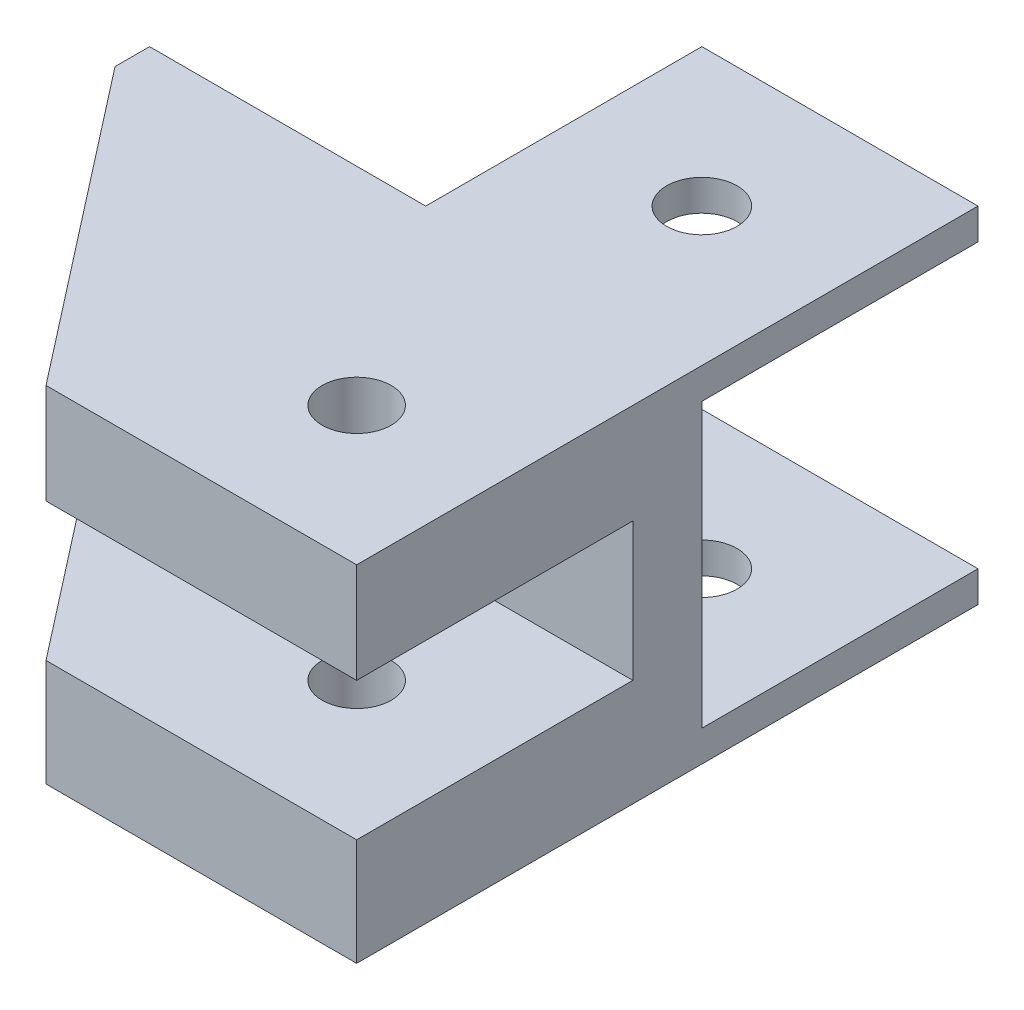
ISO-10303-21;
HEADER;
FILE_DESCRIPTION(('STEP AP214'),'2;1');
FILE_NAME('part.step','',(''),(''),'','','');
FILE_SCHEMA(('AUTOMOTIVE_DESIGN { 1 0 10303 214 1 1 1 1 }'));
ENDSEC;
DATA;
#1=APPLICATION_CONTEXT('core data for automotive mechanical design processes');
#2=APPLICATION_PROTOCOL_DEFINITION('international standard','automotive_design',2000,#1);
#3=PRODUCT_CONTEXT('',#1,'mechanical');
#4=PRODUCT('Part','Part','',(#3));
#5=PRODUCT_RELATED_PRODUCT_CATEGORY('part','',(#4));
#6=PRODUCT_DEFINITION_FORMATION('','',#4);
#7=PRODUCT_DEFINITION_CONTEXT('part definition',#1,'design');
#8=PRODUCT_DEFINITION('design','',#6,#7);
#9=PRODUCT_DEFINITION_SHAPE('','',#8);
#10=(LENGTH_UNIT() NAMED_UNIT(*) SI_UNIT(.MILLI.,.METRE.));
#11=(NAMED_UNIT(*) PLANE_ANGLE_UNIT() SI_UNIT($,.RADIAN.));
#12=(NAMED_UNIT(*) SI_UNIT($,.STERADIAN.) SOLID_ANGLE_UNIT());
#13=UNCERTAINTY_MEASURE_WITH_UNIT(LENGTH_MEASURE(1.E-05),#10,'distance_accuracy_value','');
#14=(GEOMETRIC_REPRESENTATION_CONTEXT(3) GLOBAL_UNCERTAINTY_ASSIGNED_CONTEXT((#13)) GLOBAL_UNIT_ASSIGNED_CONTEXT((#10,
#11,#12)) REPRESENTATION_CONTEXT('',''));
#15=CARTESIAN_POINT('',(0.,0.,0.));
#16=DIRECTION('',(0.,0.,1.));
#17=DIRECTION('',(1.,0.,0.));
#18=AXIS2_PLACEMENT_3D('',#15,#16,#17);
#19=CARTESIAN_POINT('',(20.,0.,-20.));
#20=DIRECTION('',(0.,0.,-1.));
#21=DIRECTION('',(0.,1.,0.));
#22=AXIS2_PLACEMENT_3D('',#19,#20,#21);
#23=PLANE('',#22);
#24=CARTESIAN_POINT('',(-10.,12.5,-20.));
#25=DIRECTION('',(0.,0.,1.));
#26=DIRECTION('',(1.,0.,0.));
#27=AXIS2_PLACEMENT_3D('',#24,#25,#26);
#28=CIRCLE('',#27,2.55);
#29=CARTESIAN_POINT('',(-7.45,12.5,-20.));
#30=VERTEX_POINT('',#29);
#31=EDGE_CURVE('E352',#30,#30,#28,.T.);
#32=ORIENTED_EDGE('',*,*,#31,.F.);
#33=EDGE_LOOP('',(#32));
#34=FACE_BOUND('',#33,.T.);
#35=DIRECTION('',(0.,1.,0.));
#36=VECTOR('',#35,1.);
#37=CARTESIAN_POINT('',(-18.0555555555555,0.,-20.));
#38=LINE('',#37,#36);
#39=CARTESIAN_POINT('',(-18.0555555555555,7.74999999999999,-20.));
#40=VERTEX_POINT('',#39);
#41=CARTESIAN_POINT('',(-18.0555555555555,17.75,-20.));
#42=VERTEX_POINT('',#41);
#43=EDGE_CURVE('E273',#40,#42,#38,.T.);
#44=ORIENTED_EDGE('',*,*,#43,.F.);
#45=DIRECTION('',(-1.,0.,0.));
#46=VECTOR('',#45,1.);
#47=CARTESIAN_POINT('',(20.,7.74999999999999,-20.));
#48=LINE('',#47,#46);
#49=CARTESIAN_POINT('',(20.,7.74999999999999,-20.));
#50=VERTEX_POINT('',#49);
#51=EDGE_CURVE('E43',#50,#40,#48,.T.);
#52=ORIENTED_EDGE('',*,*,#51,.F.);
#53=DIRECTION('',(0.,-1.,0.));
#54=VECTOR('',#53,1.);
#55=CARTESIAN_POINT('',(20.,0.,-20.));
#56=LINE('',#55,#54);
#57=CARTESIAN_POINT('',(20.,17.75,-20.));
#58=VERTEX_POINT('',#57);
#59=EDGE_CURVE('E227',#58,#50,#56,.T.);
#60=ORIENTED_EDGE('',*,*,#59,.F.);
#61=DIRECTION('',(-1.,0.,0.));
#62=VECTOR('',#61,1.);
#63=CARTESIAN_POINT('',(20.,17.75,-20.));
#64=LINE('',#63,#62);
#65=EDGE_CURVE('E172',#58,#42,#64,.T.);
#66=ORIENTED_EDGE('',*,*,#65,.T.);
#67=EDGE_LOOP('',(#44,#52,#60,#66));
#68=FACE_BOUND('',#67,.T.);
#69=ADVANCED_FACE('F35',(#34,#68),#23,.F.);
#70=CARTESIAN_POINT('',(20.,7.74999999999999,0.));
#71=DIRECTION('',(0.,-1.,0.));
#72=DIRECTION('',(0.,0.,-1.));
#73=AXIS2_PLACEMENT_3D('',#70,#71,#72);
#74=PLANE('',#73);
#75=CARTESIAN_POINT('',(10.,7.74999999999999,-10.));
#76=DIRECTION('',(0.,-1.,0.));
#77=DIRECTION('',(0.,0.,-1.));
#78=AXIS2_PLACEMENT_3D('',#75,#76,#77);
#79=CIRCLE('',#78,2.5);
#80=CARTESIAN_POINT('',(10.,7.74999999999999,-12.5));
#81=VERTEX_POINT('',#80);
#82=EDGE_CURVE('E197',#81,#81,#79,.T.);
#83=ORIENTED_EDGE('',*,*,#82,.T.);
#84=EDGE_LOOP('',(#83));
#85=FACE_BOUND('',#84,.T.);
#86=DIRECTION('',(-0.61394061351492,0.,-0.789352217376327));
#87=VECTOR('',#86,1.);
#88=CARTESIAN_POINT('',(5.98076923076923,7.74999999999999,10.9038461538461));
#89=LINE('',#88,#87);
#90=CARTESIAN_POINT('',(-2.50000000000001,7.74999999999999,0.));
#91=VERTEX_POINT('',#90);
#92=EDGE_CURVE('E278',#91,#40,#89,.T.);
#93=ORIENTED_EDGE('',*,*,#92,.F.);
#94=DIRECTION('',(-1.,0.,0.));
#95=VECTOR('',#94,1.);
#96=CARTESIAN_POINT('',(20.,7.74999999999999,0.));
#97=LINE('',#96,#95);
#98=CARTESIAN_POINT('',(20.,7.74999999999999,0.));
#99=VERTEX_POINT('',#98);
#100=EDGE_CURVE('E191',#99,#91,#97,.T.);
#101=ORIENTED_EDGE('',*,*,#100,.F.);
#102=DIRECTION('',(0.,0.,1.));
#103=VECTOR('',#102,1.);
#104=CARTESIAN_POINT('',(20.,7.74999999999999,0.));
#105=LINE('',#104,#103);
#106=EDGE_CURVE('E230',#50,#99,#105,.T.);
#107=ORIENTED_EDGE('',*,*,#106,.F.);
#108=ORIENTED_EDGE('',*,*,#51,.T.);
#109=EDGE_LOOP('',(#93,#101,#107,#108));
#110=FACE_BOUND('',#109,.T.);
#111=ADVANCED_FACE('F318',(#85,#110),#74,.F.);
#112=CARTESIAN_POINT('',(20.,0.,0.));
#113=DIRECTION('',(0.,0.,1.));
#114=DIRECTION('',(1.,0.,0.));
#115=AXIS2_PLACEMENT_3D('',#112,#113,#114);
#116=PLANE('',#115);
#117=ORIENTED_EDGE('',*,*,#100,.T.);
#118=DIRECTION('',(0.,-1.,0.));
#119=VECTOR('',#118,1.);
#120=CARTESIAN_POINT('',(-2.50000000000001,25.,0.));
#121=LINE('',#120,#119);
#122=CARTESIAN_POINT('',(-2.50000000000001,0.,0.));
#123=VERTEX_POINT('',#122);
#124=EDGE_CURVE('E150',#91,#123,#121,.T.);
#125=ORIENTED_EDGE('',*,*,#124,.T.);
#126=DIRECTION('',(-1.,0.,0.));
#127=VECTOR('',#126,1.);
#128=CARTESIAN_POINT('',(20.,0.,0.));
#129=LINE('',#128,#127);
#130=CARTESIAN_POINT('',(20.,0.,0.));
#131=VERTEX_POINT('',#130);
#132=EDGE_CURVE('E188',#131,#123,#129,.T.);
#133=ORIENTED_EDGE('',*,*,#132,.F.);
#134=DIRECTION('',(0.,1.,0.));
#135=VECTOR('',#134,1.);
#136=CARTESIAN_POINT('',(20.,0.,0.));
#137=LINE('',#136,#135);
#138=EDGE_CURVE('E233',#131,#99,#137,.T.);
#139=ORIENTED_EDGE('',*,*,#138,.T.);
#140=EDGE_LOOP('',(#117,#125,#133,#139));
#141=FACE_BOUND('',#140,.T.);
#142=ADVANCED_FACE('F314',(#141),#116,.T.);
#143=CARTESIAN_POINT('',(20.,0.,0.));
#144=DIRECTION('',(0.,1.,0.));
#145=DIRECTION('',(0.,0.,1.));
#146=AXIS2_PLACEMENT_3D('',#143,#144,#145);
#147=PLANE('',#146);
#148=CARTESIAN_POINT('',(10.,0.,-35.));
#149=DIRECTION('',(0.,1.,0.));
#150=DIRECTION('',(0.,0.,1.));
#151=AXIS2_PLACEMENT_3D('',#148,#149,#150);
#152=CIRCLE('',#151,2.55);
#153=CARTESIAN_POINT('',(10.,0.,-32.45));
#154=VERTEX_POINT('',#153);
#155=EDGE_CURVE('E210',#154,#154,#152,.T.);
#156=ORIENTED_EDGE('',*,*,#155,.T.);
#157=EDGE_LOOP('',(#156));
#158=FACE_BOUND('',#157,.T.);
#159=CARTESIAN_POINT('',(10.,0.,-10.));
#160=DIRECTION('',(0.,1.,0.));
#161=DIRECTION('',(0.,0.,1.));
#162=AXIS2_PLACEMENT_3D('',#159,#160,#161);
#163=CIRCLE('',#162,2.5);
#164=CARTESIAN_POINT('',(10.,0.,-7.5));
#165=VERTEX_POINT('',#164);
#166=EDGE_CURVE('E198',#165,#165,#163,.T.);
#167=ORIENTED_EDGE('',*,*,#166,.T.);
#168=EDGE_LOOP('',(#167));
#169=FACE_BOUND('',#168,.T.);
#170=DIRECTION('',(-0.61394061351492,0.,-0.789352217376327));
#171=VECTOR('',#170,1.);
#172=CARTESIAN_POINT('',(-1.55769230769231,0.,1.21153846153846));
#173=LINE('',#172,#171);
#174=CARTESIAN_POINT('',(-20.,0.,-22.5));
#175=VERTEX_POINT('',#174);
#176=EDGE_CURVE('E160',#123,#175,#173,.T.);
#177=ORIENTED_EDGE('',*,*,#176,.T.);
#178=DIRECTION('',(0.,0.,1.));
#179=VECTOR('',#178,1.);
#180=CARTESIAN_POINT('',(-20.,0.,0.));
#181=LINE('',#180,#179);
#182=CARTESIAN_POINT('',(-20.,0.,-25.));
#183=VERTEX_POINT('',#182);
#184=EDGE_CURVE('E286',#183,#175,#181,.T.);
#185=ORIENTED_EDGE('',*,*,#184,.F.);
#186=DIRECTION('',(1.,0.,0.));
#187=VECTOR('',#186,1.);
#188=CARTESIAN_POINT('',(-20.,0.,-25.));
#189=LINE('',#188,#187);
#190=CARTESIAN_POINT('',(0.,0.,-25.));
#191=VERTEX_POINT('',#190);
#192=EDGE_CURVE('E213',#183,#191,#189,.T.);
#193=ORIENTED_EDGE('',*,*,#192,.T.);
#194=DIRECTION('',(0.,0.,-1.));
#195=VECTOR('',#194,1.);
#196=CARTESIAN_POINT('',(0.,0.,0.));
#197=LINE('',#196,#195);
#198=CARTESIAN_POINT('',(0.,0.,-45.));
#199=VERTEX_POINT('',#198);
#200=EDGE_CURVE('E226',#191,#199,#197,.T.);
#201=ORIENTED_EDGE('',*,*,#200,.T.);
#202=DIRECTION('',(-1.,0.,0.));
#203=VECTOR('',#202,1.);
#204=CARTESIAN_POINT('',(20.,0.,-45.));
#205=LINE('',#204,#203);
#206=CARTESIAN_POINT('',(20.,0.,-45.));
#207=VERTEX_POINT('',#206);
#208=EDGE_CURVE('E185',#207,#199,#205,.T.);
#209=ORIENTED_EDGE('',*,*,#208,.F.);
#210=DIRECTION('',(0.,0.,-1.));
#211=VECTOR('',#210,1.);
#212=CARTESIAN_POINT('',(20.,0.,0.));
#213=LINE('',#212,#211);
#214=EDGE_CURVE('E236',#131,#207,#213,.T.);
#215=ORIENTED_EDGE('',*,*,#214,.F.);
#216=ORIENTED_EDGE('',*,*,#132,.T.);
#217=EDGE_LOOP('',(#177,#185,#193,#201,#209,#215,#216));
#218=FACE_BOUND('',#217,.T.);
#219=ADVANCED_FACE('F297',(#158,#169,#218),#147,.F.);
#220=CARTESIAN_POINT('',(20.,25.,0.));
#221=DIRECTION('',(0.,1.,0.));
#222=DIRECTION('',(0.,0.,1.));
#223=AXIS2_PLACEMENT_3D('',#220,#221,#222);
#224=PLANE('',#223);
#225=CARTESIAN_POINT('',(10.,25.,-10.));
#226=DIRECTION('',(0.,1.,0.));
#227=DIRECTION('',(0.,0.,1.));
#228=AXIS2_PLACEMENT_3D('',#225,#226,#227);
#229=CIRCLE('',#228,2.5);
#230=CARTESIAN_POINT('',(10.,25.,-7.5));
#231=VERTEX_POINT('',#230);
#232=EDGE_CURVE('E205',#231,#231,#229,.T.);
#233=ORIENTED_EDGE('',*,*,#232,.F.);
#234=EDGE_LOOP('',(#233));
#235=FACE_BOUND('',#234,.T.);
#236=CARTESIAN_POINT('',(10.,25.,-35.));
#237=DIRECTION('',(0.,1.,0.));
#238=DIRECTION('',(0.,0.,1.));
#239=AXIS2_PLACEMENT_3D('',#236,#237,#238);
#240=CIRCLE('',#239,2.55);
#241=CARTESIAN_POINT('',(10.,25.,-32.45));
#242=VERTEX_POINT('',#241);
#243=EDGE_CURVE('E218',#242,#242,#240,.T.);
#244=ORIENTED_EDGE('',*,*,#243,.F.);
#245=EDGE_LOOP('',(#244));
#246=FACE_BOUND('',#245,.T.);
#247=DIRECTION('',(0.,0.,-1.));
#248=VECTOR('',#247,1.);
#249=CARTESIAN_POINT('',(-20.,25.,0.));
#250=LINE('',#249,#248);
#251=CARTESIAN_POINT('',(-20.,25.,-22.5));
#252=VERTEX_POINT('',#251);
#253=CARTESIAN_POINT('',(-20.,25.,-25.));
#254=VERTEX_POINT('',#253);
#255=EDGE_CURVE('E159',#252,#254,#250,.T.);
#256=ORIENTED_EDGE('',*,*,#255,.F.);
#257=DIRECTION('',(-0.61394061351492,0.,-0.789352217376327));
#258=VECTOR('',#257,1.);
#259=CARTESIAN_POINT('',(-1.55769230769231,25.,1.21153846153846));
#260=LINE('',#259,#258);
#261=CARTESIAN_POINT('',(-2.50000000000001,25.,0.));
#262=VERTEX_POINT('',#261);
#263=EDGE_CURVE('E52',#262,#252,#260,.T.);
#264=ORIENTED_EDGE('',*,*,#263,.F.);
#265=DIRECTION('',(-1.,0.,0.));
#266=VECTOR('',#265,1.);
#267=CARTESIAN_POINT('',(20.,25.,0.));
#268=LINE('',#267,#266);
#269=CARTESIAN_POINT('',(20.,25.,0.));
#270=VERTEX_POINT('',#269);
#271=EDGE_CURVE('E156',#270,#262,#268,.T.);
#272=ORIENTED_EDGE('',*,*,#271,.F.);
#273=DIRECTION('',(0.,0.,-1.));
#274=VECTOR('',#273,1.);
#275=CARTESIAN_POINT('',(20.,25.,0.));
#276=LINE('',#275,#274);
#277=CARTESIAN_POINT('',(20.,25.,-45.));
#278=VERTEX_POINT('',#277);
#279=EDGE_CURVE('E250',#270,#278,#276,.T.);
#280=ORIENTED_EDGE('',*,*,#279,.T.);
#281=DIRECTION('',(-1.,0.,0.));
#282=VECTOR('',#281,1.);
#283=CARTESIAN_POINT('',(20.,25.,-45.));
#284=LINE('',#283,#282);
#285=CARTESIAN_POINT('',(0.,25.,-45.));
#286=VERTEX_POINT('',#285);
#287=EDGE_CURVE('E166',#278,#286,#284,.T.);
#288=ORIENTED_EDGE('',*,*,#287,.T.);
#289=DIRECTION('',(0.,0.,-1.));
#290=VECTOR('',#289,1.);
#291=CARTESIAN_POINT('',(0.,25.,0.));
#292=LINE('',#291,#290);
#293=CARTESIAN_POINT('',(0.,25.,-25.));
#294=VERTEX_POINT('',#293);
#295=EDGE_CURVE('E231',#294,#286,#292,.T.);
#296=ORIENTED_EDGE('',*,*,#295,.F.);
#297=DIRECTION('',(1.,0.,0.));
#298=VECTOR('',#297,1.);
#299=CARTESIAN_POINT('',(-20.,25.,-25.));
#300=LINE('',#299,#298);
#301=EDGE_CURVE('E289',#254,#294,#300,.T.);
#302=ORIENTED_EDGE('',*,*,#301,.F.);
#303=EDGE_LOOP('',(#256,#264,#272,#280,#288,#296,#302));
#304=FACE_BOUND('',#303,.T.);
#305=ADVANCED_FACE('F154',(#235,#246,#304),#224,.T.);
#306=CARTESIAN_POINT('',(20.,0.,0.));
#307=DIRECTION('',(0.,0.,1.));
#308=DIRECTION('',(1.,0.,0.));
#309=AXIS2_PLACEMENT_3D('',#306,#307,#308);
#310=PLANE('',#309);
#311=ORIENTED_EDGE('',*,*,#271,.T.);
#312=CARTESIAN_POINT('',(-2.50000000000001,17.75,0.));
#313=VERTEX_POINT('',#312);
#314=EDGE_CURVE('E142',#262,#313,#121,.T.);
#315=ORIENTED_EDGE('',*,*,#314,.T.);
#316=DIRECTION('',(-1.,0.,0.));
#317=VECTOR('',#316,1.);
#318=CARTESIAN_POINT('',(20.,17.75,0.));
#319=LINE('',#318,#317);
#320=CARTESIAN_POINT('',(20.,17.75,0.));
#321=VERTEX_POINT('',#320);
#322=EDGE_CURVE('E167',#321,#313,#319,.T.);
#323=ORIENTED_EDGE('',*,*,#322,.F.);
#324=DIRECTION('',(0.,1.,0.));
#325=VECTOR('',#324,1.);
#326=CARTESIAN_POINT('',(20.,0.,0.));
#327=LINE('',#326,#325);
#328=EDGE_CURVE('E165',#321,#270,#327,.T.);
#329=ORIENTED_EDGE('',*,*,#328,.T.);
#330=EDGE_LOOP('',(#311,#315,#323,#329));
#331=FACE_BOUND('',#330,.T.);
#332=ADVANCED_FACE('F163',(#331),#310,.T.);
#333=CARTESIAN_POINT('',(20.,17.75,0.));
#334=DIRECTION('',(0.,-1.,0.));
#335=DIRECTION('',(0.,0.,-1.));
#336=AXIS2_PLACEMENT_3D('',#333,#334,#335);
#337=PLANE('',#336);
#338=CARTESIAN_POINT('',(10.,17.75,-10.));
#339=DIRECTION('',(0.,-1.,0.));
#340=DIRECTION('',(0.,0.,-1.));
#341=AXIS2_PLACEMENT_3D('',#338,#339,#340);
#342=CIRCLE('',#341,2.5);
#343=CARTESIAN_POINT('',(10.,17.75,-12.5));
#344=VERTEX_POINT('',#343);
#345=EDGE_CURVE('E195',#344,#344,#342,.T.);
#346=ORIENTED_EDGE('',*,*,#345,.F.);
#347=EDGE_LOOP('',(#346));
#348=FACE_BOUND('',#347,.T.);
#349=ORIENTED_EDGE('',*,*,#322,.T.);
#350=DIRECTION('',(-0.61394061351492,0.,-0.789352217376327));
#351=VECTOR('',#350,1.);
#352=CARTESIAN_POINT('',(5.98076923076923,17.75,10.9038461538462));
#353=LINE('',#352,#351);
#354=EDGE_CURVE('E145',#313,#42,#353,.T.);
#355=ORIENTED_EDGE('',*,*,#354,.T.);
#356=ORIENTED_EDGE('',*,*,#65,.F.);
#357=DIRECTION('',(0.,0.,1.));
#358=VECTOR('',#357,1.);
#359=CARTESIAN_POINT('',(20.,17.75,0.));
#360=LINE('',#359,#358);
#361=EDGE_CURVE('E253',#58,#321,#360,.T.);
#362=ORIENTED_EDGE('',*,*,#361,.T.);
#363=EDGE_LOOP('',(#349,#355,#356,#362));
#364=FACE_BOUND('',#363,.T.);
#365=ADVANCED_FACE('F276',(#348,#364),#337,.T.);
#366=CARTESIAN_POINT('',(-20.,0.,0.));
#367=DIRECTION('',(-1.,0.,0.));
#368=DIRECTION('',(0.,0.,1.));
#369=AXIS2_PLACEMENT_3D('',#366,#367,#368);
#370=PLANE('',#369);
#371=ORIENTED_EDGE('',*,*,#184,.T.);
#372=DIRECTION('',(0.,-1.,0.));
#373=VECTOR('',#372,1.);
#374=CARTESIAN_POINT('',(-20.,25.,-22.5));
#375=LINE('',#374,#373);
#376=EDGE_CURVE('E149',#252,#175,#375,.T.);
#377=ORIENTED_EDGE('',*,*,#376,.F.);
#378=ORIENTED_EDGE('',*,*,#255,.T.);
#379=DIRECTION('',(0.,-1.,0.));
#380=VECTOR('',#379,1.);
#381=CARTESIAN_POINT('',(-20.,0.,-25.));
#382=LINE('',#381,#380);
#383=EDGE_CURVE('E283',#254,#183,#382,.T.);
#384=ORIENTED_EDGE('',*,*,#383,.T.);
#385=EDGE_LOOP('',(#371,#377,#378,#384));
#386=FACE_BOUND('',#385,.T.);
#387=ADVANCED_FACE('F358',(#386),#370,.T.);
#388=CARTESIAN_POINT('',(0.,0.,0.));
#389=DIRECTION('',(1.,0.,0.));
#390=DIRECTION('',(0.,0.,-1.));
#391=AXIS2_PLACEMENT_3D('',#388,#389,#390);
#392=PLANE('',#391);
#393=DIRECTION('',(0.,-1.,0.));
#394=VECTOR('',#393,1.);
#395=CARTESIAN_POINT('',(0.,0.,-25.));
#396=LINE('',#395,#394);
#397=CARTESIAN_POINT('',(0.,22.75,-25.));
#398=VERTEX_POINT('',#397);
#399=EDGE_CURVE('E45',#294,#398,#396,.T.);
#400=ORIENTED_EDGE('',*,*,#399,.F.);
#401=ORIENTED_EDGE('',*,*,#295,.T.);
#402=DIRECTION('',(0.,1.,0.));
#403=VECTOR('',#402,1.);
#404=CARTESIAN_POINT('',(0.,0.,-45.));
#405=LINE('',#404,#403);
#406=CARTESIAN_POINT('',(0.,22.75,-45.));
#407=VERTEX_POINT('',#406);
#408=EDGE_CURVE('E265',#407,#286,#405,.T.);
#409=ORIENTED_EDGE('',*,*,#408,.F.);
#410=DIRECTION('',(0.,0.,-1.));
#411=VECTOR('',#410,1.);
#412=CARTESIAN_POINT('',(0.,22.75,0.));
#413=LINE('',#412,#411);
#414=EDGE_CURVE('E263',#398,#407,#413,.T.);
#415=ORIENTED_EDGE('',*,*,#414,.F.);
#416=EDGE_LOOP('',(#400,#401,#409,#415));
#417=FACE_BOUND('',#416,.T.);
#418=ADVANCED_FACE('F325',(#417),#392,.F.);
#419=CARTESIAN_POINT('',(0.,2.25,-25.));
#420=VERTEX_POINT('',#419);
#421=EDGE_CURVE('E11',#420,#191,#396,.T.);
#422=ORIENTED_EDGE('',*,*,#421,.F.);
#423=DIRECTION('',(0.,0.,-1.));
#424=VECTOR('',#423,1.);
#425=CARTESIAN_POINT('',(0.,2.25,0.));
#426=LINE('',#425,#424);
#427=CARTESIAN_POINT('',(0.,2.25,-45.));
#428=VERTEX_POINT('',#427);
#429=EDGE_CURVE('E260',#420,#428,#426,.T.);
#430=ORIENTED_EDGE('',*,*,#429,.T.);
#431=DIRECTION('',(0.,1.,0.));
#432=VECTOR('',#431,1.);
#433=CARTESIAN_POINT('',(0.,0.,-45.));
#434=LINE('',#433,#432);
#435=EDGE_CURVE('E257',#199,#428,#434,.T.);
#436=ORIENTED_EDGE('',*,*,#435,.F.);
#437=ORIENTED_EDGE('',*,*,#200,.F.);
#438=EDGE_LOOP('',(#422,#430,#436,#437));
#439=FACE_BOUND('',#438,.T.);
#440=ADVANCED_FACE('F302',(#439),#392,.F.);
#441=CARTESIAN_POINT('',(20.,0.,-45.));
#442=DIRECTION('',(0.,0.,1.));
#443=DIRECTION('',(1.,0.,0.));
#444=AXIS2_PLACEMENT_3D('',#441,#442,#443);
#445=PLANE('',#444);
#446=ORIENTED_EDGE('',*,*,#435,.T.);
#447=DIRECTION('',(-1.,0.,0.));
#448=VECTOR('',#447,1.);
#449=CARTESIAN_POINT('',(20.,2.25,-45.));
#450=LINE('',#449,#448);
#451=CARTESIAN_POINT('',(20.,2.25,-45.));
#452=VERTEX_POINT('',#451);
#453=EDGE_CURVE('E183',#452,#428,#450,.T.);
#454=ORIENTED_EDGE('',*,*,#453,.F.);
#455=DIRECTION('',(0.,1.,0.));
#456=VECTOR('',#455,1.);
#457=CARTESIAN_POINT('',(20.,0.,-45.));
#458=LINE('',#457,#456);
#459=EDGE_CURVE('E238',#207,#452,#458,.T.);
#460=ORIENTED_EDGE('',*,*,#459,.F.);
#461=ORIENTED_EDGE('',*,*,#208,.T.);
#462=EDGE_LOOP('',(#446,#454,#460,#461));
#463=FACE_BOUND('',#462,.T.);
#464=ADVANCED_FACE('F306',(#463),#445,.F.);
#465=CARTESIAN_POINT('',(20.,2.25,0.));
#466=DIRECTION('',(0.,1.,0.));
#467=DIRECTION('',(0.,0.,1.));
#468=AXIS2_PLACEMENT_3D('',#465,#466,#467);
#469=PLANE('',#468);
#470=CARTESIAN_POINT('',(10.,2.25,-35.));
#471=DIRECTION('',(0.,1.,0.));
#472=DIRECTION('',(0.,0.,1.));
#473=AXIS2_PLACEMENT_3D('',#470,#471,#472);
#474=CIRCLE('',#473,2.55);
#475=CARTESIAN_POINT('',(10.,2.25,-32.45));
#476=VERTEX_POINT('',#475);
#477=EDGE_CURVE('E223',#476,#476,#474,.T.);
#478=ORIENTED_EDGE('',*,*,#477,.F.);
#479=EDGE_LOOP('',(#478));
#480=FACE_BOUND('',#479,.T.);
#481=ORIENTED_EDGE('',*,*,#429,.F.);
#482=DIRECTION('',(-1.,0.,0.));
#483=VECTOR('',#482,1.);
#484=CARTESIAN_POINT('',(20.,2.25,-25.));
#485=LINE('',#484,#483);
#486=CARTESIAN_POINT('',(20.,2.25,-25.));
#487=VERTEX_POINT('',#486);
#488=EDGE_CURVE('E180',#487,#420,#485,.T.);
#489=ORIENTED_EDGE('',*,*,#488,.F.);
#490=DIRECTION('',(0.,0.,-1.));
#491=VECTOR('',#490,1.);
#492=CARTESIAN_POINT('',(20.,2.25,0.));
#493=LINE('',#492,#491);
#494=EDGE_CURVE('E240',#487,#452,#493,.T.);
#495=ORIENTED_EDGE('',*,*,#494,.T.);
#496=ORIENTED_EDGE('',*,*,#453,.T.);
#497=EDGE_LOOP('',(#481,#489,#495,#496));
#498=FACE_BOUND('',#497,.T.);
#499=ADVANCED_FACE('F332',(#480,#498),#469,.T.);
#500=CARTESIAN_POINT('',(20.,0.,-25.));
#501=DIRECTION('',(0.,0.,-1.));
#502=DIRECTION('',(0.,1.,0.));
#503=AXIS2_PLACEMENT_3D('',#500,#501,#502);
#504=PLANE('',#503);
#505=CARTESIAN_POINT('',(-10.,12.5,-25.));
#506=DIRECTION('',(0.,0.,-1.));
#507=DIRECTION('',(0.,1.,0.));
#508=AXIS2_PLACEMENT_3D('',#505,#506,#507);
#509=CIRCLE('',#508,2.55);
#510=CARTESIAN_POINT('',(-10.,15.05,-25.));
#511=VERTEX_POINT('',#510);
#512=EDGE_CURVE('E38',#511,#511,#509,.T.);
#513=ORIENTED_EDGE('',*,*,#512,.F.);
#514=EDGE_LOOP('',(#513));
#515=FACE_BOUND('',#514,.T.);
#516=ORIENTED_EDGE('',*,*,#488,.T.);
#517=ORIENTED_EDGE('',*,*,#421,.T.);
#518=ORIENTED_EDGE('',*,*,#192,.F.);
#519=ORIENTED_EDGE('',*,*,#383,.F.);
#520=ORIENTED_EDGE('',*,*,#301,.T.);
#521=ORIENTED_EDGE('',*,*,#399,.T.);
#522=DIRECTION('',(-1.,0.,0.));
#523=VECTOR('',#522,1.);
#524=CARTESIAN_POINT('',(20.,22.75,-25.));
#525=LINE('',#524,#523);
#526=CARTESIAN_POINT('',(20.,22.75,-25.));
#527=VERTEX_POINT('',#526);
#528=EDGE_CURVE('E178',#527,#398,#525,.T.);
#529=ORIENTED_EDGE('',*,*,#528,.F.);
#530=DIRECTION('',(0.,-1.,0.));
#531=VECTOR('',#530,1.);
#532=CARTESIAN_POINT('',(20.,0.,-25.));
#533=LINE('',#532,#531);
#534=EDGE_CURVE('E243',#527,#487,#533,.T.);
#535=ORIENTED_EDGE('',*,*,#534,.T.);
#536=EDGE_LOOP('',(#516,#517,#518,#519,#520,#521,#529,#535));
#537=FACE_BOUND('',#536,.T.);
#538=ADVANCED_FACE('F299',(#515,#537),#504,.T.);
#539=CARTESIAN_POINT('',(20.,22.75,0.));
#540=DIRECTION('',(0.,1.,0.));
#541=DIRECTION('',(0.,0.,1.));
#542=AXIS2_PLACEMENT_3D('',#539,#540,#541);
#543=PLANE('',#542);
#544=CARTESIAN_POINT('',(10.,22.75,-35.));
#545=DIRECTION('',(0.,1.,0.));
#546=DIRECTION('',(0.,0.,1.));
#547=AXIS2_PLACEMENT_3D('',#544,#545,#546);
#548=CIRCLE('',#547,2.55);
#549=CARTESIAN_POINT('',(10.,22.75,-32.45));
#550=VERTEX_POINT('',#549);
#551=EDGE_CURVE('E202',#550,#550,#548,.T.);
#552=ORIENTED_EDGE('',*,*,#551,.T.);
#553=EDGE_LOOP('',(#552));
#554=FACE_BOUND('',#553,.T.);
#555=ORIENTED_EDGE('',*,*,#414,.T.);
#556=DIRECTION('',(-1.,0.,0.));
#557=VECTOR('',#556,1.);
#558=CARTESIAN_POINT('',(20.,22.75,-45.));
#559=LINE('',#558,#557);
#560=CARTESIAN_POINT('',(20.,22.75,-45.));
#561=VERTEX_POINT('',#560);
#562=EDGE_CURVE('E170',#561,#407,#559,.T.);
#563=ORIENTED_EDGE('',*,*,#562,.F.);
#564=DIRECTION('',(0.,0.,-1.));
#565=VECTOR('',#564,1.);
#566=CARTESIAN_POINT('',(20.,22.75,0.));
#567=LINE('',#566,#565);
#568=EDGE_CURVE('E246',#527,#561,#567,.T.);
#569=ORIENTED_EDGE('',*,*,#568,.F.);
#570=ORIENTED_EDGE('',*,*,#528,.T.);
#571=EDGE_LOOP('',(#555,#563,#569,#570));
#572=FACE_BOUND('',#571,.T.);
#573=ADVANCED_FACE('F329',(#554,#572),#543,.F.);
#574=CARTESIAN_POINT('',(20.,0.,-45.));
#575=DIRECTION('',(0.,0.,1.));
#576=DIRECTION('',(1.,0.,0.));
#577=AXIS2_PLACEMENT_3D('',#574,#575,#576);
#578=PLANE('',#577);
#579=ORIENTED_EDGE('',*,*,#408,.T.);
#580=ORIENTED_EDGE('',*,*,#287,.F.);
#581=DIRECTION('',(0.,1.,0.));
#582=VECTOR('',#581,1.);
#583=CARTESIAN_POINT('',(20.,0.,-45.));
#584=LINE('',#583,#582);
#585=EDGE_CURVE('E248',#561,#278,#584,.T.);
#586=ORIENTED_EDGE('',*,*,#585,.F.);
#587=ORIENTED_EDGE('',*,*,#562,.T.);
#588=EDGE_LOOP('',(#579,#580,#586,#587));
#589=FACE_BOUND('',#588,.T.);
#590=ADVANCED_FACE('F323',(#589),#578,.F.);
#591=CARTESIAN_POINT('',(20.,0.,0.));
#592=DIRECTION('',(1.,0.,0.));
#593=DIRECTION('',(0.,0.,-1.));
#594=AXIS2_PLACEMENT_3D('',#591,#592,#593);
#595=PLANE('',#594);
#596=ORIENTED_EDGE('',*,*,#59,.T.);
#597=ORIENTED_EDGE('',*,*,#106,.T.);
#598=ORIENTED_EDGE('',*,*,#138,.F.);
#599=ORIENTED_EDGE('',*,*,#214,.T.);
#600=ORIENTED_EDGE('',*,*,#459,.T.);
#601=ORIENTED_EDGE('',*,*,#494,.F.);
#602=ORIENTED_EDGE('',*,*,#534,.F.);
#603=ORIENTED_EDGE('',*,*,#568,.T.);
#604=ORIENTED_EDGE('',*,*,#585,.T.);
#605=ORIENTED_EDGE('',*,*,#279,.F.);
#606=ORIENTED_EDGE('',*,*,#328,.F.);
#607=ORIENTED_EDGE('',*,*,#361,.F.);
#608=EDGE_LOOP('',(#596,#597,#598,#599,#600,#601,#602,#603,#604,#605,#606,#607));
#609=FACE_BOUND('',#608,.T.);
#610=ADVANCED_FACE('F311',(#609),#595,.T.);
#611=CARTESIAN_POINT('',(10.,0.,-10.));
#612=DIRECTION('',(0.,1.,0.));
#613=DIRECTION('',(0.,0.,1.));
#614=AXIS2_PLACEMENT_3D('',#611,#612,#613);
#615=CYLINDRICAL_SURFACE('',#614,2.5);
#616=ORIENTED_EDGE('',*,*,#345,.T.);
#617=EDGE_LOOP('',(#616));
#618=FACE_BOUND('',#617,.T.);
#619=ORIENTED_EDGE('',*,*,#232,.T.);
#620=EDGE_LOOP('',(#619));
#621=FACE_BOUND('',#620,.T.);
#622=ADVANCED_FACE('F371',(#618,#621),#615,.F.);
#623=CARTESIAN_POINT('',(10.,0.,-35.));
#624=DIRECTION('',(0.,1.,0.));
#625=DIRECTION('',(0.,0.,1.));
#626=AXIS2_PLACEMENT_3D('',#623,#624,#625);
#627=CYLINDRICAL_SURFACE('',#626,2.55);
#628=ORIENTED_EDGE('',*,*,#243,.T.);
#629=EDGE_LOOP('',(#628));
#630=FACE_BOUND('',#629,.T.);
#631=ORIENTED_EDGE('',*,*,#551,.F.);
#632=EDGE_LOOP('',(#631));
#633=FACE_BOUND('',#632,.T.);
#634=ADVANCED_FACE('F374',(#630,#633),#627,.F.);
#635=ORIENTED_EDGE('',*,*,#477,.T.);
#636=EDGE_LOOP('',(#635));
#637=FACE_BOUND('',#636,.T.);
#638=ORIENTED_EDGE('',*,*,#155,.F.);
#639=EDGE_LOOP('',(#638));
#640=FACE_BOUND('',#639,.T.);
#641=ADVANCED_FACE('F376',(#637,#640),#627,.F.);
#642=ORIENTED_EDGE('',*,*,#166,.F.);
#643=EDGE_LOOP('',(#642));
#644=FACE_BOUND('',#643,.T.);
#645=ORIENTED_EDGE('',*,*,#82,.F.);
#646=EDGE_LOOP('',(#645));
#647=FACE_BOUND('',#646,.T.);
#648=ADVANCED_FACE('F375',(#644,#647),#615,.F.);
#649=CARTESIAN_POINT('',(-1.55769230769231,25.,1.21153846153846));
#650=DIRECTION('',(-0.789352217376326,0.,0.61394061351492));
#651=DIRECTION('',(0.61394061351492,0.,0.789352217376327));
#652=AXIS2_PLACEMENT_3D('',#649,#650,#651);
#653=PLANE('',#652);
#654=ORIENTED_EDGE('',*,*,#92,.T.);
#655=ORIENTED_EDGE('',*,*,#43,.T.);
#656=ORIENTED_EDGE('',*,*,#354,.F.);
#657=ORIENTED_EDGE('',*,*,#314,.F.);
#658=ORIENTED_EDGE('',*,*,#263,.T.);
#659=ORIENTED_EDGE('',*,*,#376,.T.);
#660=ORIENTED_EDGE('',*,*,#176,.F.);
#661=ORIENTED_EDGE('',*,*,#124,.F.);
#662=EDGE_LOOP('',(#654,#655,#656,#657,#658,#659,#660,#661));
#663=FACE_BOUND('',#662,.T.);
#664=ADVANCED_FACE('F143',(#663),#653,.T.);
#665=CARTESIAN_POINT('',(-10.,12.5,-40.));
#666=DIRECTION('',(0.,0.,1.));
#667=DIRECTION('',(1.,0.,0.));
#668=AXIS2_PLACEMENT_3D('',#665,#666,#667);
#669=CYLINDRICAL_SURFACE('',#668,2.55);
#670=ORIENTED_EDGE('',*,*,#512,.T.);
#671=EDGE_LOOP('',(#670));
#672=FACE_BOUND('',#671,.T.);
#673=ORIENTED_EDGE('',*,*,#31,.T.);
#674=EDGE_LOOP('',(#673));
#675=FACE_BOUND('',#674,.T.);
#676=ADVANCED_FACE('F420',(#672,#675),#669,.F.);
#677=CLOSED_SHELL('',(#69,#111,#142,#219,#305,#332,#365,#387,#418,#440,#464,#499,#538,#573,#590,
#610,#622,#634,#641,#648,#664,#676));
#678=MANIFOLD_SOLID_BREP('B2',#677);
#679=ADVANCED_BREP_SHAPE_REPRESENTATION('',(#18,#678),#14);
#680=SHAPE_DEFINITION_REPRESENTATION(#9,#679);
ENDSEC;
END-ISO-10303-21;
